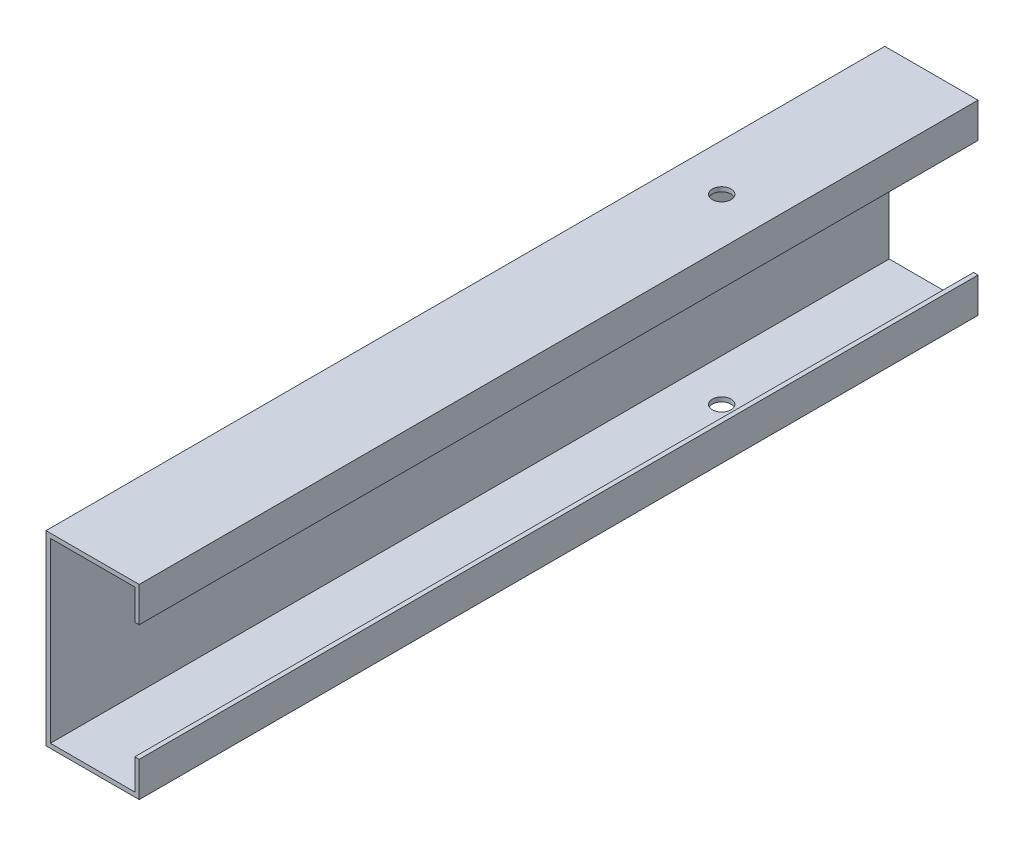
ISO-10303-21;
HEADER;
FILE_DESCRIPTION(('STEP AP214'),'2;1');
FILE_NAME('part.step','',(''),(''),'','','');
FILE_SCHEMA(('AUTOMOTIVE_DESIGN { 1 0 10303 214 1 1 1 1 }'));
ENDSEC;
DATA;
#1=APPLICATION_CONTEXT('core data for automotive mechanical design processes');
#2=APPLICATION_PROTOCOL_DEFINITION('international standard','automotive_design',2000,#1);
#3=PRODUCT_CONTEXT('',#1,'mechanical');
#4=PRODUCT('Part','Part','',(#3));
#5=PRODUCT_RELATED_PRODUCT_CATEGORY('part','',(#4));
#6=PRODUCT_DEFINITION_FORMATION('','',#4);
#7=PRODUCT_DEFINITION_CONTEXT('part definition',#1,'design');
#8=PRODUCT_DEFINITION('design','',#6,#7);
#9=PRODUCT_DEFINITION_SHAPE('','',#8);
#10=(LENGTH_UNIT() NAMED_UNIT(*) SI_UNIT(.MILLI.,.METRE.));
#11=(NAMED_UNIT(*) PLANE_ANGLE_UNIT() SI_UNIT($,.RADIAN.));
#12=(NAMED_UNIT(*) SI_UNIT($,.STERADIAN.) SOLID_ANGLE_UNIT());
#13=UNCERTAINTY_MEASURE_WITH_UNIT(LENGTH_MEASURE(1.E-05),#10,'distance_accuracy_value','');
#14=(GEOMETRIC_REPRESENTATION_CONTEXT(3) GLOBAL_UNCERTAINTY_ASSIGNED_CONTEXT((#13)) GLOBAL_UNIT_ASSIGNED_CONTEXT((#10,
#11,#12)) REPRESENTATION_CONTEXT('',''));
#15=CARTESIAN_POINT('',(0.,0.,0.));
#16=DIRECTION('',(0.,0.,1.));
#17=DIRECTION('',(1.,0.,0.));
#18=AXIS2_PLACEMENT_3D('',#15,#16,#17);
#19=CARTESIAN_POINT('',(18.1,0.,360.));
#20=DIRECTION('',(-1.,0.,0.));
#21=DIRECTION('',(0.,0.,1.));
#22=AXIS2_PLACEMENT_3D('',#19,#20,#21);
#23=PLANE('',#22);
#24=DIRECTION('',(0.,1.,0.));
#25=VECTOR('',#24,1.);
#26=CARTESIAN_POINT('',(18.1,0.,0.));
#27=LINE('',#26,#25);
#28=CARTESIAN_POINT('',(18.1,-38.1,0.));
#29=VERTEX_POINT('',#28);
#30=CARTESIAN_POINT('',(18.1,-25.,0.));
#31=VERTEX_POINT('',#30);
#32=EDGE_CURVE('E166',#29,#31,#27,.T.);
#33=ORIENTED_EDGE('',*,*,#32,.F.);
#34=DIRECTION('',(0.,0.,-1.));
#35=VECTOR('',#34,1.);
#36=CARTESIAN_POINT('',(18.1,-38.1,360.));
#37=LINE('',#36,#35);
#38=CARTESIAN_POINT('',(18.1,-38.1,360.));
#39=VERTEX_POINT('',#38);
#40=EDGE_CURVE('E11',#39,#29,#37,.T.);
#41=ORIENTED_EDGE('',*,*,#40,.F.);
#42=DIRECTION('',(0.,1.,0.));
#43=VECTOR('',#42,1.);
#44=CARTESIAN_POINT('',(18.1,0.,360.));
#45=LINE('',#44,#43);
#46=CARTESIAN_POINT('',(18.1,-25.,360.));
#47=VERTEX_POINT('',#46);
#48=EDGE_CURVE('E205',#39,#47,#45,.T.);
#49=ORIENTED_EDGE('',*,*,#48,.T.);
#50=DIRECTION('',(0.,0.,-1.));
#51=VECTOR('',#50,1.);
#52=CARTESIAN_POINT('',(18.1,-25.,360.));
#53=LINE('',#52,#51);
#54=EDGE_CURVE('E108',#47,#31,#53,.T.);
#55=ORIENTED_EDGE('',*,*,#54,.T.);
#56=EDGE_LOOP('',(#33,#41,#49,#55));
#57=FACE_BOUND('',#56,.T.);
#58=ADVANCED_FACE('F44',(#57),#23,.T.);
#59=CARTESIAN_POINT('',(0.,-38.1,360.));
#60=DIRECTION('',(0.,-1.,0.));
#61=DIRECTION('',(1.,0.,0.));
#62=AXIS2_PLACEMENT_3D('',#59,#60,#61);
#63=PLANE('',#62);
#64=CARTESIAN_POINT('',(0.,-38.1,90.));
#65=DIRECTION('',(0.,-1.,0.));
#66=DIRECTION('',(1.,0.,0.));
#67=AXIS2_PLACEMENT_3D('',#64,#65,#66);
#68=CIRCLE('',#67,4.);
#69=CARTESIAN_POINT('',(4.00000000000001,-38.1,90.));
#70=VERTEX_POINT('',#69);
#71=EDGE_CURVE('E357',#70,#70,#68,.T.);
#72=ORIENTED_EDGE('',*,*,#71,.T.);
#73=EDGE_LOOP('',(#72));
#74=FACE_BOUND('',#73,.T.);
#75=DIRECTION('',(-1.,0.,0.));
#76=VECTOR('',#75,1.);
#77=CARTESIAN_POINT('',(0.,-38.1,0.));
#78=LINE('',#77,#76);
#79=CARTESIAN_POINT('',(-18.1,-38.1,0.));
#80=VERTEX_POINT('',#79);
#81=EDGE_CURVE('E170',#29,#80,#78,.T.);
#82=ORIENTED_EDGE('',*,*,#81,.T.);
#83=DIRECTION('',(0.,0.,-1.));
#84=VECTOR('',#83,1.);
#85=CARTESIAN_POINT('',(-18.1,-38.1,360.));
#86=LINE('',#85,#84);
#87=CARTESIAN_POINT('',(-18.1,-38.1,360.));
#88=VERTEX_POINT('',#87);
#89=EDGE_CURVE('E53',#88,#80,#86,.T.);
#90=ORIENTED_EDGE('',*,*,#89,.F.);
#91=DIRECTION('',(-1.,0.,0.));
#92=VECTOR('',#91,1.);
#93=CARTESIAN_POINT('',(0.,-38.1,360.));
#94=LINE('',#93,#92);
#95=EDGE_CURVE('E288',#39,#88,#94,.T.);
#96=ORIENTED_EDGE('',*,*,#95,.F.);
#97=ORIENTED_EDGE('',*,*,#40,.T.);
#98=EDGE_LOOP('',(#82,#90,#96,#97));
#99=FACE_BOUND('',#98,.T.);
#100=ADVANCED_FACE('F295',(#74,#99),#63,.F.);
#101=CARTESIAN_POINT('',(-18.1,0.,360.));
#102=DIRECTION('',(-1.,0.,0.));
#103=DIRECTION('',(0.,0.,1.));
#104=AXIS2_PLACEMENT_3D('',#101,#102,#103);
#105=PLANE('',#104);
#106=CARTESIAN_POINT('',(-18.1,0.,270.));
#107=DIRECTION('',(-1.,0.,0.));
#108=DIRECTION('',(0.,0.,1.));
#109=AXIS2_PLACEMENT_3D('',#106,#107,#108);
#110=CIRCLE('',#109,3.99999999999999);
#111=CARTESIAN_POINT('',(-18.1,0.,274.));
#112=VERTEX_POINT('',#111);
#113=EDGE_CURVE('E171',#112,#112,#110,.T.);
#114=ORIENTED_EDGE('',*,*,#113,.T.);
#115=EDGE_LOOP('',(#114));
#116=FACE_BOUND('',#115,.T.);
#117=CARTESIAN_POINT('',(-18.1,0.,90.0000000000001));
#118=DIRECTION('',(-1.,0.,0.));
#119=DIRECTION('',(0.,0.,1.));
#120=AXIS2_PLACEMENT_3D('',#117,#118,#119);
#121=CIRCLE('',#120,3.99999999999999);
#122=CARTESIAN_POINT('',(-18.1,0.,94.0000000000001));
#123=VERTEX_POINT('',#122);
#124=EDGE_CURVE('E373',#123,#123,#121,.T.);
#125=ORIENTED_EDGE('',*,*,#124,.T.);
#126=EDGE_LOOP('',(#125));
#127=FACE_BOUND('',#126,.T.);
#128=DIRECTION('',(0.,1.,0.));
#129=VECTOR('',#128,1.);
#130=CARTESIAN_POINT('',(-18.1,0.,0.));
#131=LINE('',#130,#129);
#132=CARTESIAN_POINT('',(-18.1,38.1,0.));
#133=VERTEX_POINT('',#132);
#134=EDGE_CURVE('E174',#80,#133,#131,.T.);
#135=ORIENTED_EDGE('',*,*,#134,.T.);
#136=DIRECTION('',(0.,0.,-1.));
#137=VECTOR('',#136,1.);
#138=CARTESIAN_POINT('',(-18.1,38.1,360.));
#139=LINE('',#138,#137);
#140=CARTESIAN_POINT('',(-18.1,38.1,360.));
#141=VERTEX_POINT('',#140);
#142=EDGE_CURVE('E229',#141,#133,#139,.T.);
#143=ORIENTED_EDGE('',*,*,#142,.F.);
#144=DIRECTION('',(0.,1.,0.));
#145=VECTOR('',#144,1.);
#146=CARTESIAN_POINT('',(-18.1,0.,360.));
#147=LINE('',#146,#145);
#148=EDGE_CURVE('E240',#88,#141,#147,.T.);
#149=ORIENTED_EDGE('',*,*,#148,.F.);
#150=ORIENTED_EDGE('',*,*,#89,.T.);
#151=EDGE_LOOP('',(#135,#143,#149,#150));
#152=FACE_BOUND('',#151,.T.);
#153=ADVANCED_FACE('F238',(#116,#127,#152),#105,.F.);
#154=CARTESIAN_POINT('',(0.,38.1,360.));
#155=DIRECTION('',(0.,1.,0.));
#156=DIRECTION('',(0.,0.,1.));
#157=AXIS2_PLACEMENT_3D('',#154,#155,#156);
#158=PLANE('',#157);
#159=CARTESIAN_POINT('',(0.,38.1,90.));
#160=DIRECTION('',(0.,1.,0.));
#161=DIRECTION('',(0.,0.,1.));
#162=AXIS2_PLACEMENT_3D('',#159,#160,#161);
#163=CIRCLE('',#162,4.);
#164=CARTESIAN_POINT('',(0.,38.1,94.));
#165=VERTEX_POINT('',#164);
#166=EDGE_CURVE('E360',#165,#165,#163,.T.);
#167=ORIENTED_EDGE('',*,*,#166,.T.);
#168=EDGE_LOOP('',(#167));
#169=FACE_BOUND('',#168,.T.);
#170=DIRECTION('',(1.,0.,0.));
#171=VECTOR('',#170,1.);
#172=CARTESIAN_POINT('',(0.,38.1,0.));
#173=LINE('',#172,#171);
#174=CARTESIAN_POINT('',(18.1,38.1,0.));
#175=VERTEX_POINT('',#174);
#176=EDGE_CURVE('E177',#133,#175,#173,.T.);
#177=ORIENTED_EDGE('',*,*,#176,.T.);
#178=DIRECTION('',(0.,0.,-1.));
#179=VECTOR('',#178,1.);
#180=CARTESIAN_POINT('',(18.1,38.1,360.));
#181=LINE('',#180,#179);
#182=CARTESIAN_POINT('',(18.1,38.1,360.));
#183=VERTEX_POINT('',#182);
#184=EDGE_CURVE('E225',#183,#175,#181,.T.);
#185=ORIENTED_EDGE('',*,*,#184,.F.);
#186=DIRECTION('',(1.,0.,0.));
#187=VECTOR('',#186,1.);
#188=CARTESIAN_POINT('',(0.,38.1,360.));
#189=LINE('',#188,#187);
#190=EDGE_CURVE('E260',#141,#183,#189,.T.);
#191=ORIENTED_EDGE('',*,*,#190,.F.);
#192=ORIENTED_EDGE('',*,*,#142,.T.);
#193=EDGE_LOOP('',(#177,#185,#191,#192));
#194=FACE_BOUND('',#193,.T.);
#195=ADVANCED_FACE('F249',(#169,#194),#158,.F.);
#196=CARTESIAN_POINT('',(18.1,0.,360.));
#197=DIRECTION('',(1.,0.,0.));
#198=DIRECTION('',(0.,0.,-1.));
#199=AXIS2_PLACEMENT_3D('',#196,#197,#198);
#200=PLANE('',#199);
#201=DIRECTION('',(0.,-1.,0.));
#202=VECTOR('',#201,1.);
#203=CARTESIAN_POINT('',(18.1,0.,0.));
#204=LINE('',#203,#202);
#205=CARTESIAN_POINT('',(18.1,25.,0.));
#206=VERTEX_POINT('',#205);
#207=EDGE_CURVE('E180',#175,#206,#204,.T.);
#208=ORIENTED_EDGE('',*,*,#207,.T.);
#209=DIRECTION('',(0.,0.,-1.));
#210=VECTOR('',#209,1.);
#211=CARTESIAN_POINT('',(18.1,25.,360.));
#212=LINE('',#211,#210);
#213=CARTESIAN_POINT('',(18.1,25.,360.));
#214=VERTEX_POINT('',#213);
#215=EDGE_CURVE('E222',#214,#206,#212,.T.);
#216=ORIENTED_EDGE('',*,*,#215,.F.);
#217=DIRECTION('',(0.,-1.,0.));
#218=VECTOR('',#217,1.);
#219=CARTESIAN_POINT('',(18.1,0.,360.));
#220=LINE('',#219,#218);
#221=EDGE_CURVE('E255',#183,#214,#220,.T.);
#222=ORIENTED_EDGE('',*,*,#221,.F.);
#223=ORIENTED_EDGE('',*,*,#184,.T.);
#224=EDGE_LOOP('',(#208,#216,#222,#223));
#225=FACE_BOUND('',#224,.T.);
#226=ADVANCED_FACE('F253',(#225),#200,.F.);
#227=CARTESIAN_POINT('',(1.82602471155454E-13,25.0000000000001,360.));
#228=DIRECTION('',(0.,-1.,0.));
#229=DIRECTION('',(1.,0.,0.));
#230=AXIS2_PLACEMENT_3D('',#227,#228,#229);
#231=PLANE('',#230);
#232=DIRECTION('',(-1.,0.,0.));
#233=VECTOR('',#232,1.);
#234=CARTESIAN_POINT('',(1.82602471155454E-13,25.0000000000001,0.));
#235=LINE('',#234,#233);
#236=CARTESIAN_POINT('',(20.,25.,0.));
#237=VERTEX_POINT('',#236);
#238=EDGE_CURVE('E184',#237,#206,#235,.T.);
#239=ORIENTED_EDGE('',*,*,#238,.F.);
#240=DIRECTION('',(0.,0.,-1.));
#241=VECTOR('',#240,1.);
#242=CARTESIAN_POINT('',(20.,25.,360.));
#243=LINE('',#242,#241);
#244=CARTESIAN_POINT('',(20.,25.,360.));
#245=VERTEX_POINT('',#244);
#246=EDGE_CURVE('E219',#245,#237,#243,.T.);
#247=ORIENTED_EDGE('',*,*,#246,.F.);
#248=DIRECTION('',(-1.,0.,0.));
#249=VECTOR('',#248,1.);
#250=CARTESIAN_POINT('',(1.82602471155454E-13,25.0000000000001,360.));
#251=LINE('',#250,#249);
#252=EDGE_CURVE('E259',#245,#214,#251,.T.);
#253=ORIENTED_EDGE('',*,*,#252,.T.);
#254=ORIENTED_EDGE('',*,*,#215,.T.);
#255=EDGE_LOOP('',(#239,#247,#253,#254));
#256=FACE_BOUND('',#255,.T.);
#257=ADVANCED_FACE('F312',(#256),#231,.T.);
#258=CARTESIAN_POINT('',(20.,0.,360.));
#259=DIRECTION('',(1.,0.,0.));
#260=DIRECTION('',(0.,0.,-1.));
#261=AXIS2_PLACEMENT_3D('',#258,#259,#260);
#262=PLANE('',#261);
#263=DIRECTION('',(0.,-1.,0.));
#264=VECTOR('',#263,1.);
#265=CARTESIAN_POINT('',(20.,0.,0.));
#266=LINE('',#265,#264);
#267=CARTESIAN_POINT('',(20.,40.,0.));
#268=VERTEX_POINT('',#267);
#269=EDGE_CURVE('E188',#268,#237,#266,.T.);
#270=ORIENTED_EDGE('',*,*,#269,.F.);
#271=DIRECTION('',(0.,0.,-1.));
#272=VECTOR('',#271,1.);
#273=CARTESIAN_POINT('',(20.,40.,360.));
#274=LINE('',#273,#272);
#275=CARTESIAN_POINT('',(20.,40.,360.));
#276=VERTEX_POINT('',#275);
#277=EDGE_CURVE('E216',#276,#268,#274,.T.);
#278=ORIENTED_EDGE('',*,*,#277,.F.);
#279=DIRECTION('',(0.,-1.,0.));
#280=VECTOR('',#279,1.);
#281=CARTESIAN_POINT('',(20.,0.,360.));
#282=LINE('',#281,#280);
#283=EDGE_CURVE('E264',#276,#245,#282,.T.);
#284=ORIENTED_EDGE('',*,*,#283,.T.);
#285=ORIENTED_EDGE('',*,*,#246,.T.);
#286=EDGE_LOOP('',(#270,#278,#284,#285));
#287=FACE_BOUND('',#286,.T.);
#288=ADVANCED_FACE('F315',(#287),#262,.T.);
#289=CARTESIAN_POINT('',(0.,40.,360.));
#290=DIRECTION('',(0.,-1.,0.));
#291=DIRECTION('',(0.,0.,-1.));
#292=AXIS2_PLACEMENT_3D('',#289,#290,#291);
#293=PLANE('',#292);
#294=CARTESIAN_POINT('',(0.,40.,90.));
#295=DIRECTION('',(0.,1.,0.));
#296=DIRECTION('',(0.,0.,1.));
#297=AXIS2_PLACEMENT_3D('',#294,#295,#296);
#298=CIRCLE('',#297,4.);
#299=CARTESIAN_POINT('',(0.,40.,94.));
#300=VERTEX_POINT('',#299);
#301=EDGE_CURVE('E386',#300,#300,#298,.T.);
#302=ORIENTED_EDGE('',*,*,#301,.F.);
#303=EDGE_LOOP('',(#302));
#304=FACE_BOUND('',#303,.T.);
#305=DIRECTION('',(-1.,0.,0.));
#306=VECTOR('',#305,1.);
#307=CARTESIAN_POINT('',(0.,40.,0.));
#308=LINE('',#307,#306);
#309=CARTESIAN_POINT('',(-20.,40.,0.));
#310=VERTEX_POINT('',#309);
#311=EDGE_CURVE('E192',#268,#310,#308,.T.);
#312=ORIENTED_EDGE('',*,*,#311,.T.);
#313=DIRECTION('',(0.,0.,-1.));
#314=VECTOR('',#313,1.);
#315=CARTESIAN_POINT('',(-20.,40.,360.));
#316=LINE('',#315,#314);
#317=CARTESIAN_POINT('',(-20.,40.,360.));
#318=VERTEX_POINT('',#317);
#319=EDGE_CURVE('E212',#318,#310,#316,.T.);
#320=ORIENTED_EDGE('',*,*,#319,.F.);
#321=DIRECTION('',(-1.,0.,0.));
#322=VECTOR('',#321,1.);
#323=CARTESIAN_POINT('',(0.,40.,360.));
#324=LINE('',#323,#322);
#325=EDGE_CURVE('E272',#276,#318,#324,.T.);
#326=ORIENTED_EDGE('',*,*,#325,.F.);
#327=ORIENTED_EDGE('',*,*,#277,.T.);
#328=EDGE_LOOP('',(#312,#320,#326,#327));
#329=FACE_BOUND('',#328,.T.);
#330=ADVANCED_FACE('F279',(#304,#329),#293,.F.);
#331=CARTESIAN_POINT('',(-20.,0.,360.));
#332=DIRECTION('',(1.,0.,0.));
#333=DIRECTION('',(0.,0.,-1.));
#334=AXIS2_PLACEMENT_3D('',#331,#332,#333);
#335=PLANE('',#334);
#336=CARTESIAN_POINT('',(-20.,0.,270.));
#337=DIRECTION('',(-1.,0.,0.));
#338=DIRECTION('',(0.,0.,1.));
#339=AXIS2_PLACEMENT_3D('',#336,#337,#338);
#340=CIRCLE('',#339,3.99999999999999);
#341=CARTESIAN_POINT('',(-20.,0.,274.));
#342=VERTEX_POINT('',#341);
#343=EDGE_CURVE('E365',#342,#342,#340,.T.);
#344=ORIENTED_EDGE('',*,*,#343,.F.);
#345=EDGE_LOOP('',(#344));
#346=FACE_BOUND('',#345,.T.);
#347=CARTESIAN_POINT('',(-20.,0.,90.0000000000001));
#348=DIRECTION('',(-1.,0.,0.));
#349=DIRECTION('',(0.,0.,-1.));
#350=AXIS2_PLACEMENT_3D('',#347,#348,#349);
#351=CIRCLE('',#350,3.99999999999999);
#352=CARTESIAN_POINT('',(-20.,0.,86.0000000000001));
#353=VERTEX_POINT('',#352);
#354=EDGE_CURVE('E359',#353,#353,#351,.T.);
#355=ORIENTED_EDGE('',*,*,#354,.F.);
#356=EDGE_LOOP('',(#355));
#357=FACE_BOUND('',#356,.T.);
#358=DIRECTION('',(0.,-1.,0.));
#359=VECTOR('',#358,1.);
#360=CARTESIAN_POINT('',(-20.,0.,0.));
#361=LINE('',#360,#359);
#362=CARTESIAN_POINT('',(-20.,-40.,0.));
#363=VERTEX_POINT('',#362);
#364=EDGE_CURVE('E195',#310,#363,#361,.T.);
#365=ORIENTED_EDGE('',*,*,#364,.T.);
#366=DIRECTION('',(0.,0.,-1.));
#367=VECTOR('',#366,1.);
#368=CARTESIAN_POINT('',(-20.,-40.,360.));
#369=LINE('',#368,#367);
#370=CARTESIAN_POINT('',(-20.,-40.,360.));
#371=VERTEX_POINT('',#370);
#372=EDGE_CURVE('E156',#371,#363,#369,.T.);
#373=ORIENTED_EDGE('',*,*,#372,.F.);
#374=DIRECTION('',(0.,-1.,0.));
#375=VECTOR('',#374,1.);
#376=CARTESIAN_POINT('',(-20.,0.,360.));
#377=LINE('',#376,#375);
#378=EDGE_CURVE('E145',#318,#371,#377,.T.);
#379=ORIENTED_EDGE('',*,*,#378,.F.);
#380=ORIENTED_EDGE('',*,*,#319,.T.);
#381=EDGE_LOOP('',(#365,#373,#379,#380));
#382=FACE_BOUND('',#381,.T.);
#383=ADVANCED_FACE('F283',(#346,#357,#382),#335,.F.);
#384=CARTESIAN_POINT('',(0.,-40.,360.));
#385=DIRECTION('',(0.,1.,0.));
#386=DIRECTION('',(0.,0.,1.));
#387=AXIS2_PLACEMENT_3D('',#384,#385,#386);
#388=PLANE('',#387);
#389=CARTESIAN_POINT('',(0.,-40.,90.));
#390=DIRECTION('',(0.,1.,0.));
#391=DIRECTION('',(0.,0.,1.));
#392=AXIS2_PLACEMENT_3D('',#389,#390,#391);
#393=CIRCLE('',#392,4.);
#394=CARTESIAN_POINT('',(0.,-40.,94.));
#395=VERTEX_POINT('',#394);
#396=EDGE_CURVE('E355',#395,#395,#393,.T.);
#397=ORIENTED_EDGE('',*,*,#396,.T.);
#398=EDGE_LOOP('',(#397));
#399=FACE_BOUND('',#398,.T.);
#400=DIRECTION('',(1.,0.,0.));
#401=VECTOR('',#400,1.);
#402=CARTESIAN_POINT('',(0.,-40.,0.));
#403=LINE('',#402,#401);
#404=CARTESIAN_POINT('',(20.,-40.,0.));
#405=VERTEX_POINT('',#404);
#406=EDGE_CURVE('E154',#363,#405,#403,.T.);
#407=ORIENTED_EDGE('',*,*,#406,.T.);
#408=DIRECTION('',(0.,0.,-1.));
#409=VECTOR('',#408,1.);
#410=CARTESIAN_POINT('',(20.,-40.,360.));
#411=LINE('',#410,#409);
#412=CARTESIAN_POINT('',(20.,-40.,360.));
#413=VERTEX_POINT('',#412);
#414=EDGE_CURVE('E151',#413,#405,#411,.T.);
#415=ORIENTED_EDGE('',*,*,#414,.F.);
#416=DIRECTION('',(1.,0.,0.));
#417=VECTOR('',#416,1.);
#418=CARTESIAN_POINT('',(0.,-40.,360.));
#419=LINE('',#418,#417);
#420=EDGE_CURVE('E139',#371,#413,#419,.T.);
#421=ORIENTED_EDGE('',*,*,#420,.F.);
#422=ORIENTED_EDGE('',*,*,#372,.T.);
#423=EDGE_LOOP('',(#407,#415,#421,#422));
#424=FACE_BOUND('',#423,.T.);
#425=ADVANCED_FACE('F152',(#399,#424),#388,.F.);
#426=CARTESIAN_POINT('',(19.9999999999998,1.09561482693271E-13,360.));
#427=DIRECTION('',(-1.,0.,0.));
#428=DIRECTION('',(0.,-1.,0.));
#429=AXIS2_PLACEMENT_3D('',#426,#427,#428);
#430=PLANE('',#429);
#431=DIRECTION('',(0.,1.,0.));
#432=VECTOR('',#431,1.);
#433=CARTESIAN_POINT('',(19.9999999999998,1.09561482693271E-13,0.));
#434=LINE('',#433,#432);
#435=CARTESIAN_POINT('',(20.,-25.,0.));
#436=VERTEX_POINT('',#435);
#437=EDGE_CURVE('E101',#405,#436,#434,.T.);
#438=ORIENTED_EDGE('',*,*,#437,.T.);
#439=DIRECTION('',(0.,0.,-1.));
#440=VECTOR('',#439,1.);
#441=CARTESIAN_POINT('',(20.,-25.,360.));
#442=LINE('',#441,#440);
#443=CARTESIAN_POINT('',(20.,-25.,360.));
#444=VERTEX_POINT('',#443);
#445=EDGE_CURVE('E157',#444,#436,#442,.T.);
#446=ORIENTED_EDGE('',*,*,#445,.F.);
#447=DIRECTION('',(0.,1.,0.));
#448=VECTOR('',#447,1.);
#449=CARTESIAN_POINT('',(19.9999999999998,1.09561482693271E-13,360.));
#450=LINE('',#449,#448);
#451=EDGE_CURVE('E143',#413,#444,#450,.T.);
#452=ORIENTED_EDGE('',*,*,#451,.F.);
#453=ORIENTED_EDGE('',*,*,#414,.T.);
#454=EDGE_LOOP('',(#438,#446,#452,#453));
#455=FACE_BOUND('',#454,.T.);
#456=ADVANCED_FACE('F159',(#455),#430,.F.);
#457=CARTESIAN_POINT('',(1.82602471155454E-13,-25.0000000000001,360.));
#458=DIRECTION('',(0.,-1.,0.));
#459=DIRECTION('',(1.,0.,0.));
#460=AXIS2_PLACEMENT_3D('',#457,#458,#459);
#461=PLANE('',#460);
#462=DIRECTION('',(-1.,0.,0.));
#463=VECTOR('',#462,1.);
#464=CARTESIAN_POINT('',(1.82602471155454E-13,-25.0000000000001,0.));
#465=LINE('',#464,#463);
#466=EDGE_CURVE('E202',#436,#31,#465,.T.);
#467=ORIENTED_EDGE('',*,*,#466,.T.);
#468=ORIENTED_EDGE('',*,*,#54,.F.);
#469=DIRECTION('',(-1.,0.,0.));
#470=VECTOR('',#469,1.);
#471=CARTESIAN_POINT('',(1.82602471155454E-13,-25.0000000000001,360.));
#472=LINE('',#471,#470);
#473=EDGE_CURVE('E61',#444,#47,#472,.T.);
#474=ORIENTED_EDGE('',*,*,#473,.F.);
#475=ORIENTED_EDGE('',*,*,#445,.T.);
#476=EDGE_LOOP('',(#467,#468,#474,#475));
#477=FACE_BOUND('',#476,.T.);
#478=ADVANCED_FACE('F286',(#477),#461,.F.);
#479=CARTESIAN_POINT('',(0.,0.,360.));
#480=DIRECTION('',(0.,0.,1.));
#481=DIRECTION('',(1.,0.,0.));
#482=AXIS2_PLACEMENT_3D('',#479,#480,#481);
#483=PLANE('',#482);
#484=ORIENTED_EDGE('',*,*,#48,.F.);
#485=ORIENTED_EDGE('',*,*,#95,.T.);
#486=ORIENTED_EDGE('',*,*,#148,.T.);
#487=ORIENTED_EDGE('',*,*,#190,.T.);
#488=ORIENTED_EDGE('',*,*,#221,.T.);
#489=ORIENTED_EDGE('',*,*,#252,.F.);
#490=ORIENTED_EDGE('',*,*,#283,.F.);
#491=ORIENTED_EDGE('',*,*,#325,.T.);
#492=ORIENTED_EDGE('',*,*,#378,.T.);
#493=ORIENTED_EDGE('',*,*,#420,.T.);
#494=ORIENTED_EDGE('',*,*,#451,.T.);
#495=ORIENTED_EDGE('',*,*,#473,.T.);
#496=EDGE_LOOP('',(#484,#485,#486,#487,#488,#489,#490,#491,#492,#493,#494,#495));
#497=FACE_BOUND('',#496,.T.);
#498=ADVANCED_FACE('F141',(#497),#483,.T.);
#499=CARTESIAN_POINT('',(0.,0.,0.));
#500=DIRECTION('',(0.,0.,1.));
#501=DIRECTION('',(1.,0.,0.));
#502=AXIS2_PLACEMENT_3D('',#499,#500,#501);
#503=PLANE('',#502);
#504=ORIENTED_EDGE('',*,*,#32,.T.);
#505=ORIENTED_EDGE('',*,*,#466,.F.);
#506=ORIENTED_EDGE('',*,*,#437,.F.);
#507=ORIENTED_EDGE('',*,*,#406,.F.);
#508=ORIENTED_EDGE('',*,*,#364,.F.);
#509=ORIENTED_EDGE('',*,*,#311,.F.);
#510=ORIENTED_EDGE('',*,*,#269,.T.);
#511=ORIENTED_EDGE('',*,*,#238,.T.);
#512=ORIENTED_EDGE('',*,*,#207,.F.);
#513=ORIENTED_EDGE('',*,*,#176,.F.);
#514=ORIENTED_EDGE('',*,*,#134,.F.);
#515=ORIENTED_EDGE('',*,*,#81,.F.);
#516=EDGE_LOOP('',(#504,#505,#506,#507,#508,#509,#510,#511,#512,#513,#514,#515));
#517=FACE_BOUND('',#516,.T.);
#518=ADVANCED_FACE('F245',(#517),#503,.F.);
#519=CARTESIAN_POINT('',(20.,0.,90.0000000000001));
#520=DIRECTION('',(-1.,0.,0.));
#521=DIRECTION('',(0.,0.,1.));
#522=AXIS2_PLACEMENT_3D('',#519,#520,#521);
#523=CYLINDRICAL_SURFACE('',#522,3.99999999999999);
#524=ORIENTED_EDGE('',*,*,#354,.T.);
#525=EDGE_LOOP('',(#524));
#526=FACE_BOUND('',#525,.T.);
#527=ORIENTED_EDGE('',*,*,#124,.F.);
#528=EDGE_LOOP('',(#527));
#529=FACE_BOUND('',#528,.T.);
#530=ADVANCED_FACE('F335',(#526,#529),#523,.F.);
#531=CARTESIAN_POINT('',(20.,0.,270.));
#532=DIRECTION('',(-1.,0.,0.));
#533=DIRECTION('',(0.,0.,1.));
#534=AXIS2_PLACEMENT_3D('',#531,#532,#533);
#535=CYLINDRICAL_SURFACE('',#534,3.99999999999999);
#536=ORIENTED_EDGE('',*,*,#343,.T.);
#537=EDGE_LOOP('',(#536));
#538=FACE_BOUND('',#537,.T.);
#539=ORIENTED_EDGE('',*,*,#113,.F.);
#540=EDGE_LOOP('',(#539));
#541=FACE_BOUND('',#540,.T.);
#542=ADVANCED_FACE('F340',(#538,#541),#535,.F.);
#543=CARTESIAN_POINT('',(0.,-40.,90.));
#544=DIRECTION('',(0.,1.,0.));
#545=DIRECTION('',(0.,0.,1.));
#546=AXIS2_PLACEMENT_3D('',#543,#544,#545);
#547=CYLINDRICAL_SURFACE('',#546,4.);
#548=ORIENTED_EDGE('',*,*,#396,.F.);
#549=EDGE_LOOP('',(#548));
#550=FACE_BOUND('',#549,.T.);
#551=ORIENTED_EDGE('',*,*,#71,.F.);
#552=EDGE_LOOP('',(#551));
#553=FACE_BOUND('',#552,.T.);
#554=ADVANCED_FACE('F343',(#550,#553),#547,.F.);
#555=ORIENTED_EDGE('',*,*,#301,.T.);
#556=EDGE_LOOP('',(#555));
#557=FACE_BOUND('',#556,.T.);
#558=ORIENTED_EDGE('',*,*,#166,.F.);
#559=EDGE_LOOP('',(#558));
#560=FACE_BOUND('',#559,.T.);
#561=ADVANCED_FACE('F346',(#557,#560),#547,.F.);
#562=CLOSED_SHELL('',(#58,#100,#153,#195,#226,#257,#288,#330,#383,#425,#456,#478,#498,#518,#530,
#542,#554,#561));
#563=MANIFOLD_SOLID_BREP('B2',#562);
#564=ADVANCED_BREP_SHAPE_REPRESENTATION('',(#18,#563),#14);
#565=SHAPE_DEFINITION_REPRESENTATION(#9,#564);
ENDSEC;
END-ISO-10303-21;
